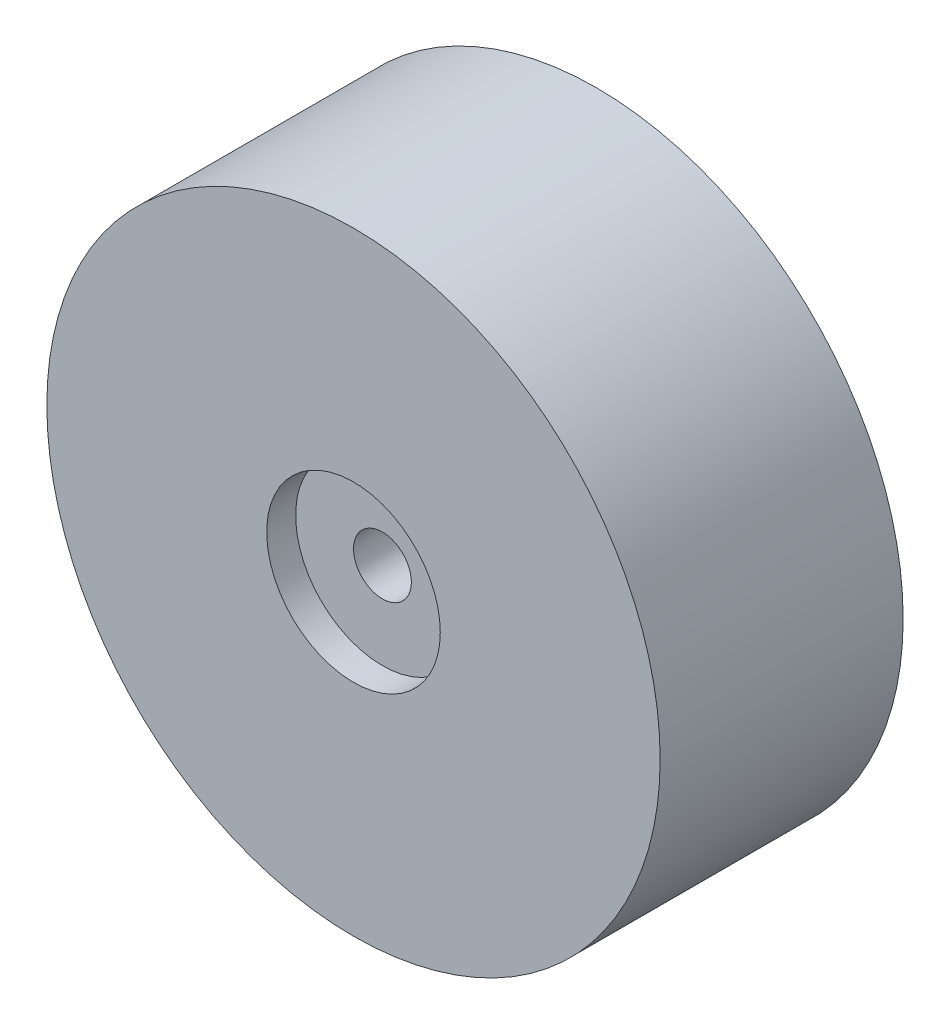
ISO-10303-21;
HEADER;
FILE_DESCRIPTION(('STEP AP214'),'2;1');
FILE_NAME('part.step','',(''),(''),'','','');
FILE_SCHEMA(('AUTOMOTIVE_DESIGN { 1 0 10303 214 1 1 1 1 }'));
ENDSEC;
DATA;
#1=APPLICATION_CONTEXT('core data for automotive mechanical design processes');
#2=APPLICATION_PROTOCOL_DEFINITION('international standard','automotive_design',2000,#1);
#3=PRODUCT_CONTEXT('',#1,'mechanical');
#4=PRODUCT('Part','Part','',(#3));
#5=PRODUCT_RELATED_PRODUCT_CATEGORY('part','',(#4));
#6=PRODUCT_DEFINITION_FORMATION('','',#4);
#7=PRODUCT_DEFINITION_CONTEXT('part definition',#1,'design');
#8=PRODUCT_DEFINITION('design','',#6,#7);
#9=PRODUCT_DEFINITION_SHAPE('','',#8);
#10=(LENGTH_UNIT() NAMED_UNIT(*) SI_UNIT(.MILLI.,.METRE.));
#11=(NAMED_UNIT(*) PLANE_ANGLE_UNIT() SI_UNIT($,.RADIAN.));
#12=(NAMED_UNIT(*) SI_UNIT($,.STERADIAN.) SOLID_ANGLE_UNIT());
#13=UNCERTAINTY_MEASURE_WITH_UNIT(LENGTH_MEASURE(1.E-05),#10,'distance_accuracy_value','');
#14=(GEOMETRIC_REPRESENTATION_CONTEXT(3) GLOBAL_UNCERTAINTY_ASSIGNED_CONTEXT((#13)) GLOBAL_UNIT_ASSIGNED_CONTEXT((#10,
#11,#12)) REPRESENTATION_CONTEXT('',''));
#15=CARTESIAN_POINT('',(0.,0.,0.));
#16=DIRECTION('',(0.,0.,1.));
#17=DIRECTION('',(1.,0.,0.));
#18=AXIS2_PLACEMENT_3D('',#15,#16,#17);
#19=CARTESIAN_POINT('',(0.,0.,-10.5));
#20=DIRECTION('',(0.,0.,1.));
#21=DIRECTION('',(1.,0.,0.));
#22=AXIS2_PLACEMENT_3D('',#19,#20,#21);
#23=CYLINDRICAL_SURFACE('',#22,7.5);
#24=CARTESIAN_POINT('',(0.,0.,-10.5));
#25=DIRECTION('',(0.,0.,1.));
#26=DIRECTION('',(1.,0.,0.));
#27=AXIS2_PLACEMENT_3D('',#24,#25,#26);
#28=CIRCLE('',#27,7.5);
#29=CARTESIAN_POINT('',(7.5,0.,-10.5));
#30=VERTEX_POINT('',#29);
#31=EDGE_CURVE('E41',#30,#30,#28,.T.);
#32=CARTESIAN_POINT('',(0.,0.,-8.));
#33=DIRECTION('',(0.,0.,1.));
#34=DIRECTION('',(1.,0.,0.));
#35=AXIS2_PLACEMENT_3D('',#32,#33,#34);
#36=CIRCLE('',#35,7.5);
#37=CARTESIAN_POINT('',(7.5,0.,-8.));
#38=VERTEX_POINT('',#37);
#39=EDGE_CURVE('E10',#38,#38,#36,.F.);
#40=CARTESIAN_POINT('',(7.5,0.,-10.5));
#41=CARTESIAN_POINT('',(7.5,0.,-10.4739583333333));
#42=CARTESIAN_POINT('',(7.5,0.,-10.4479166666667));
#43=CARTESIAN_POINT('',(7.5,0.,-10.3958333333333));
#44=CARTESIAN_POINT('',(7.5,0.,-10.3697916666667));
#45=CARTESIAN_POINT('',(7.5,0.,-10.3177083333333));
#46=CARTESIAN_POINT('',(7.5,0.,-10.2916666666667));
#47=CARTESIAN_POINT('',(7.5,0.,-10.2395833333333));
#48=CARTESIAN_POINT('',(7.5,0.,-10.2135416666667));
#49=CARTESIAN_POINT('',(7.5,0.,-10.1614583333333));
#50=CARTESIAN_POINT('',(7.5,0.,-10.1354166666667));
#51=CARTESIAN_POINT('',(7.5,0.,-10.0833333333333));
#52=CARTESIAN_POINT('',(7.5,0.,-10.0572916666667));
#53=CARTESIAN_POINT('',(7.5,0.,-10.0052083333333));
#54=CARTESIAN_POINT('',(7.5,0.,-9.97916666666667));
#55=CARTESIAN_POINT('',(7.5,0.,-9.92708333333333));
#56=CARTESIAN_POINT('',(7.5,0.,-9.90104166666667));
#57=CARTESIAN_POINT('',(7.5,0.,-9.84895833333333));
#58=CARTESIAN_POINT('',(7.5,0.,-9.82291666666667));
#59=CARTESIAN_POINT('',(7.5,0.,-9.77083333333333));
#60=CARTESIAN_POINT('',(7.5,0.,-9.74479166666667));
#61=CARTESIAN_POINT('',(7.5,0.,-9.69270833333333));
#62=CARTESIAN_POINT('',(7.5,0.,-9.66666666666667));
#63=CARTESIAN_POINT('',(7.5,0.,-9.61458333333333));
#64=CARTESIAN_POINT('',(7.5,0.,-9.58854166666667));
#65=CARTESIAN_POINT('',(7.5,0.,-9.53645833333333));
#66=CARTESIAN_POINT('',(7.5,0.,-9.51041666666667));
#67=CARTESIAN_POINT('',(7.5,0.,-9.45833333333333));
#68=CARTESIAN_POINT('',(7.5,0.,-9.43229166666667));
#69=CARTESIAN_POINT('',(7.5,0.,-9.38020833333333));
#70=CARTESIAN_POINT('',(7.5,0.,-9.35416666666667));
#71=CARTESIAN_POINT('',(7.5,0.,-9.30208333333333));
#72=CARTESIAN_POINT('',(7.5,0.,-9.27604166666667));
#73=CARTESIAN_POINT('',(7.5,0.,-9.22395833333333));
#74=CARTESIAN_POINT('',(7.5,0.,-9.19791666666667));
#75=CARTESIAN_POINT('',(7.5,0.,-9.14583333333333));
#76=CARTESIAN_POINT('',(7.5,0.,-9.11979166666667));
#77=CARTESIAN_POINT('',(7.5,0.,-9.06770833333333));
#78=CARTESIAN_POINT('',(7.5,0.,-9.04166666666667));
#79=CARTESIAN_POINT('',(7.5,0.,-8.98958333333333));
#80=CARTESIAN_POINT('',(7.5,0.,-8.96354166666667));
#81=CARTESIAN_POINT('',(7.5,0.,-8.91145833333333));
#82=CARTESIAN_POINT('',(7.5,0.,-8.88541666666667));
#83=CARTESIAN_POINT('',(7.5,0.,-8.83333333333333));
#84=CARTESIAN_POINT('',(7.5,0.,-8.80729166666667));
#85=CARTESIAN_POINT('',(7.5,0.,-8.75520833333333));
#86=CARTESIAN_POINT('',(7.5,0.,-8.72916666666667));
#87=CARTESIAN_POINT('',(7.5,0.,-8.67708333333333));
#88=CARTESIAN_POINT('',(7.5,0.,-8.65104166666667));
#89=CARTESIAN_POINT('',(7.5,0.,-8.59895833333333));
#90=CARTESIAN_POINT('',(7.5,0.,-8.57291666666667));
#91=CARTESIAN_POINT('',(7.5,0.,-8.52083333333333));
#92=CARTESIAN_POINT('',(7.5,0.,-8.49479166666667));
#93=CARTESIAN_POINT('',(7.5,0.,-8.44270833333334));
#94=CARTESIAN_POINT('',(7.5,0.,-8.41666666666667));
#95=CARTESIAN_POINT('',(7.5,0.,-8.36458333333334));
#96=CARTESIAN_POINT('',(7.5,0.,-8.33854166666667));
#97=CARTESIAN_POINT('',(7.5,0.,-8.28645833333334));
#98=CARTESIAN_POINT('',(7.5,0.,-8.26041666666667));
#99=CARTESIAN_POINT('',(7.5,0.,-8.20833333333334));
#100=CARTESIAN_POINT('',(7.5,0.,-8.18229166666667));
#101=CARTESIAN_POINT('',(7.5,0.,-8.13020833333333));
#102=CARTESIAN_POINT('',(7.5,0.,-8.10416666666667));
#103=CARTESIAN_POINT('',(7.5,0.,-8.05208333333333));
#104=CARTESIAN_POINT('',(7.5,0.,-8.02604166666667));
#105=CARTESIAN_POINT('',(7.5,0.,-8.));
#106=B_SPLINE_CURVE_WITH_KNOTS('',3,(#40,#41,#42,#43,#44,#45,#46,#47,#48,#49,#50,#51,#52,#53,
#54,#55,#56,#57,#58,#59,#60,#61,#62,#63,#64,#65,#66,#67,#68,#69,#70,#71,#72,#73,#74,#75,#76,#77,
#78,#79,#80,#81,#82,#83,#84,#85,#86,#87,#88,#89,#90,#91,#92,#93,#94,#95,#96,#97,#98,#99,#100,
#101,#102,#103,#104,#105),.UNSPECIFIED.,.F.,.F.,(4,2,2,2,2,2,2,2,2,2,2,2,2,2,2,2,2,2,2,2,2,2,2,
2,2,2,2,2,2,2,2,2,4),(0.,0.0781249999999983,0.156249999999998,0.234374999999998,
0.312499999999999,0.390624999999999,0.468749999999999,0.546874999999999,0.624999999999999,
0.703124999999999,0.781249999999999,0.859374999999999,0.937499999999999,1.015625,1.09375,
1.171875,1.25,1.328125,1.40625,1.484375,1.5625,1.640625,1.71875,1.796875,1.875,1.953125,2.03125,
2.109375,2.1875,2.265625,2.34375,2.421875,2.5),.UNSPECIFIED.);
#107=EDGE_CURVE('BSEAM30',#30,#38,#106,.T.);
#108=ORIENTED_EDGE('',*,*,#31,.F.);
#109=ORIENTED_EDGE('',*,*,#39,.F.);
#110=ORIENTED_EDGE('',*,*,#107,.T.);
#111=ORIENTED_EDGE('',*,*,#107,.F.);
#112=EDGE_LOOP('',(#108,#110,#109,#111));
#113=FACE_BOUND('',#112,.T.);
#114=ADVANCED_FACE('F30',(#113),#23,.F.);
#115=CARTESIAN_POINT('',(0.,0.,-10.5));
#116=DIRECTION('',(0.,0.,1.));
#117=DIRECTION('',(1.,0.,0.));
#118=AXIS2_PLACEMENT_3D('',#115,#116,#117);
#119=CYLINDRICAL_SURFACE('',#118,26.5);
#120=CARTESIAN_POINT('',(0.,0.,-10.5));
#121=DIRECTION('',(0.,0.,1.));
#122=DIRECTION('',(1.,0.,0.));
#123=AXIS2_PLACEMENT_3D('',#120,#121,#122);
#124=CIRCLE('',#123,26.5);
#125=CARTESIAN_POINT('',(26.5,0.,-10.5));
#126=VERTEX_POINT('',#125);
#127=EDGE_CURVE('E37',#126,#126,#124,.T.);
#128=CARTESIAN_POINT('',(0.,0.,10.5));
#129=DIRECTION('',(0.,0.,1.));
#130=DIRECTION('',(1.,0.,0.));
#131=AXIS2_PLACEMENT_3D('',#128,#129,#130);
#132=CIRCLE('',#131,26.5);
#133=CARTESIAN_POINT('',(26.5,0.,10.5));
#134=VERTEX_POINT('',#133);
#135=EDGE_CURVE('E45',#134,#134,#132,.T.);
#136=CARTESIAN_POINT('',(26.5,0.,-10.5));
#137=CARTESIAN_POINT('',(26.5,0.,-10.28125));
#138=CARTESIAN_POINT('',(26.5,0.,-10.0625));
#139=CARTESIAN_POINT('',(26.5,0.,-9.625));
#140=CARTESIAN_POINT('',(26.5,0.,-9.40625));
#141=CARTESIAN_POINT('',(26.5,0.,-8.96875));
#142=CARTESIAN_POINT('',(26.5,0.,-8.75));
#143=CARTESIAN_POINT('',(26.5,0.,-8.3125));
#144=CARTESIAN_POINT('',(26.5,0.,-8.09375));
#145=CARTESIAN_POINT('',(26.5,0.,-7.65625));
#146=CARTESIAN_POINT('',(26.5,0.,-7.4375));
#147=CARTESIAN_POINT('',(26.5,0.,-7.));
#148=CARTESIAN_POINT('',(26.5,0.,-6.78125));
#149=CARTESIAN_POINT('',(26.5,0.,-6.34375));
#150=CARTESIAN_POINT('',(26.5,0.,-6.125));
#151=CARTESIAN_POINT('',(26.5,0.,-5.6875));
#152=CARTESIAN_POINT('',(26.5,0.,-5.46875));
#153=CARTESIAN_POINT('',(26.5,0.,-5.03125));
#154=CARTESIAN_POINT('',(26.5,0.,-4.8125));
#155=CARTESIAN_POINT('',(26.5,0.,-4.375));
#156=CARTESIAN_POINT('',(26.5,0.,-4.15625));
#157=CARTESIAN_POINT('',(26.5,0.,-3.71875));
#158=CARTESIAN_POINT('',(26.5,0.,-3.5));
#159=CARTESIAN_POINT('',(26.5,0.,-3.0625));
#160=CARTESIAN_POINT('',(26.5,0.,-2.84375));
#161=CARTESIAN_POINT('',(26.5,0.,-2.40625));
#162=CARTESIAN_POINT('',(26.5,0.,-2.1875));
#163=CARTESIAN_POINT('',(26.5,0.,-1.75));
#164=CARTESIAN_POINT('',(26.5,0.,-1.53125));
#165=CARTESIAN_POINT('',(26.5,0.,-1.09375));
#166=CARTESIAN_POINT('',(26.5,0.,-0.875000000000003));
#167=CARTESIAN_POINT('',(26.5,0.,-0.437500000000002));
#168=CARTESIAN_POINT('',(26.5,0.,-0.218750000000002));
#169=CARTESIAN_POINT('',(26.5,0.,0.218749999999998));
#170=CARTESIAN_POINT('',(26.5,0.,0.437499999999999));
#171=CARTESIAN_POINT('',(26.5,0.,0.874999999999999));
#172=CARTESIAN_POINT('',(26.5,0.,1.09375));
#173=CARTESIAN_POINT('',(26.5,0.,1.53125));
#174=CARTESIAN_POINT('',(26.5,0.,1.75));
#175=CARTESIAN_POINT('',(26.5,0.,2.1875));
#176=CARTESIAN_POINT('',(26.5,0.,2.40625));
#177=CARTESIAN_POINT('',(26.5,0.,2.84375));
#178=CARTESIAN_POINT('',(26.5,0.,3.0625));
#179=CARTESIAN_POINT('',(26.5,0.,3.5));
#180=CARTESIAN_POINT('',(26.5,0.,3.71875));
#181=CARTESIAN_POINT('',(26.5,0.,4.15625));
#182=CARTESIAN_POINT('',(26.5,0.,4.375));
#183=CARTESIAN_POINT('',(26.5,0.,4.8125));
#184=CARTESIAN_POINT('',(26.5,0.,5.03125));
#185=CARTESIAN_POINT('',(26.5,0.,5.46875));
#186=CARTESIAN_POINT('',(26.5,0.,5.6875));
#187=CARTESIAN_POINT('',(26.5,0.,6.125));
#188=CARTESIAN_POINT('',(26.5,0.,6.34375));
#189=CARTESIAN_POINT('',(26.5,0.,6.78125));
#190=CARTESIAN_POINT('',(26.5,0.,7.));
#191=CARTESIAN_POINT('',(26.5,0.,7.4375));
#192=CARTESIAN_POINT('',(26.5,0.,7.65625));
#193=CARTESIAN_POINT('',(26.5,0.,8.09375));
#194=CARTESIAN_POINT('',(26.5,0.,8.3125));
#195=CARTESIAN_POINT('',(26.5,0.,8.75));
#196=CARTESIAN_POINT('',(26.5,0.,8.96875));
#197=CARTESIAN_POINT('',(26.5,0.,9.40625));
#198=CARTESIAN_POINT('',(26.5,0.,9.625));
#199=CARTESIAN_POINT('',(26.5,0.,10.0625));
#200=CARTESIAN_POINT('',(26.5,0.,10.28125));
#201=CARTESIAN_POINT('',(26.5,0.,10.5));
#202=B_SPLINE_CURVE_WITH_KNOTS('',3,(#136,#137,#138,#139,#140,#141,#142,#143,#144,#145,#146,
#147,#148,#149,#150,#151,#152,#153,#154,#155,#156,#157,#158,#159,#160,#161,#162,#163,#164,#165,
#166,#167,#168,#169,#170,#171,#172,#173,#174,#175,#176,#177,#178,#179,#180,#181,#182,#183,#184,
#185,#186,#187,#188,#189,#190,#191,#192,#193,#194,#195,#196,#197,#198,#199,#200,#201),
.UNSPECIFIED.,.F.,.F.,(4,2,2,2,2,2,2,2,2,2,2,2,2,2,2,2,2,2,2,2,2,2,2,2,2,2,2,2,2,2,2,2,4),(0.,
0.656250000000001,1.3125,1.96875,2.625,3.28125,3.9375,4.59375,5.25,5.90625,6.5625,7.21875,7.875,
8.53125,9.1875,9.84375,10.5,11.15625,11.8125,12.46875,13.125,13.78125,14.4375,15.09375,15.75,
16.40625,17.0625,17.71875,18.375,19.03125,19.6875,20.34375,21.),.UNSPECIFIED.);
#203=EDGE_CURVE('BSEAM32',#126,#134,#202,.T.);
#204=ORIENTED_EDGE('',*,*,#127,.T.);
#205=ORIENTED_EDGE('',*,*,#135,.F.);
#206=ORIENTED_EDGE('',*,*,#203,.T.);
#207=ORIENTED_EDGE('',*,*,#203,.F.);
#208=EDGE_LOOP('',(#204,#206,#205,#207));
#209=FACE_BOUND('',#208,.T.);
#210=ADVANCED_FACE('F32',(#209),#119,.T.);
#211=CARTESIAN_POINT('',(0.,0.,-10.5));
#212=DIRECTION('',(0.,0.,1.));
#213=DIRECTION('',(1.,0.,0.));
#214=AXIS2_PLACEMENT_3D('',#211,#212,#213);
#215=PLANE('',#214);
#216=ORIENTED_EDGE('',*,*,#31,.T.);
#217=EDGE_LOOP('',(#216));
#218=FACE_BOUND('',#217,.T.);
#219=ORIENTED_EDGE('',*,*,#127,.F.);
#220=EDGE_LOOP('',(#219));
#221=FACE_BOUND('',#220,.T.);
#222=ADVANCED_FACE('F82',(#218,#221),#215,.F.);
#223=CARTESIAN_POINT('',(0.,0.,8.));
#224=DIRECTION('',(0.,0.,1.));
#225=DIRECTION('',(1.,0.,0.));
#226=AXIS2_PLACEMENT_3D('',#223,#224,#225);
#227=CIRCLE('',#226,7.5);
#228=CARTESIAN_POINT('',(7.5,0.,8.));
#229=VERTEX_POINT('',#228);
#230=EDGE_CURVE('E56',#229,#229,#227,.T.);
#231=CARTESIAN_POINT('',(0.,0.,10.5));
#232=DIRECTION('',(0.,0.,1.));
#233=DIRECTION('',(1.,0.,0.));
#234=AXIS2_PLACEMENT_3D('',#231,#232,#233);
#235=CIRCLE('',#234,7.5);
#236=CARTESIAN_POINT('',(7.5,0.,10.5));
#237=VERTEX_POINT('',#236);
#238=EDGE_CURVE('E50',#237,#237,#235,.T.);
#239=CARTESIAN_POINT('',(7.5,0.,8.));
#240=CARTESIAN_POINT('',(7.5,0.,8.02604166666666));
#241=CARTESIAN_POINT('',(7.5,0.,8.05208333333333));
#242=CARTESIAN_POINT('',(7.5,0.,8.10416666666666));
#243=CARTESIAN_POINT('',(7.5,0.,8.13020833333333));
#244=CARTESIAN_POINT('',(7.5,0.,8.18229166666667));
#245=CARTESIAN_POINT('',(7.5,0.,8.20833333333333));
#246=CARTESIAN_POINT('',(7.5,0.,8.26041666666667));
#247=CARTESIAN_POINT('',(7.5,0.,8.28645833333333));
#248=CARTESIAN_POINT('',(7.5,0.,8.33854166666666));
#249=CARTESIAN_POINT('',(7.5,0.,8.36458333333333));
#250=CARTESIAN_POINT('',(7.5,0.,8.41666666666666));
#251=CARTESIAN_POINT('',(7.5,0.,8.44270833333333));
#252=CARTESIAN_POINT('',(7.5,0.,8.49479166666667));
#253=CARTESIAN_POINT('',(7.5,0.,8.52083333333333));
#254=CARTESIAN_POINT('',(7.5,0.,8.57291666666667));
#255=CARTESIAN_POINT('',(7.5,0.,8.59895833333333));
#256=CARTESIAN_POINT('',(7.5,0.,8.65104166666666));
#257=CARTESIAN_POINT('',(7.5,0.,8.67708333333333));
#258=CARTESIAN_POINT('',(7.5,0.,8.72916666666666));
#259=CARTESIAN_POINT('',(7.5,0.,8.75520833333333));
#260=CARTESIAN_POINT('',(7.5,0.,8.80729166666667));
#261=CARTESIAN_POINT('',(7.5,0.,8.83333333333333));
#262=CARTESIAN_POINT('',(7.5,0.,8.88541666666667));
#263=CARTESIAN_POINT('',(7.5,0.,8.91145833333333));
#264=CARTESIAN_POINT('',(7.5,0.,8.96354166666666));
#265=CARTESIAN_POINT('',(7.5,0.,8.98958333333333));
#266=CARTESIAN_POINT('',(7.5,0.,9.04166666666666));
#267=CARTESIAN_POINT('',(7.5,0.,9.06770833333333));
#268=CARTESIAN_POINT('',(7.5,0.,9.11979166666667));
#269=CARTESIAN_POINT('',(7.5,0.,9.14583333333333));
#270=CARTESIAN_POINT('',(7.5,0.,9.19791666666667));
#271=CARTESIAN_POINT('',(7.5,0.,9.22395833333333));
#272=CARTESIAN_POINT('',(7.5,0.,9.27604166666666));
#273=CARTESIAN_POINT('',(7.5,0.,9.30208333333333));
#274=CARTESIAN_POINT('',(7.5,0.,9.35416666666666));
#275=CARTESIAN_POINT('',(7.5,0.,9.38020833333333));
#276=CARTESIAN_POINT('',(7.5,0.,9.43229166666667));
#277=CARTESIAN_POINT('',(7.5,0.,9.45833333333333));
#278=CARTESIAN_POINT('',(7.5,0.,9.51041666666667));
#279=CARTESIAN_POINT('',(7.5,0.,9.53645833333333));
#280=CARTESIAN_POINT('',(7.5,0.,9.58854166666667));
#281=CARTESIAN_POINT('',(7.5,0.,9.61458333333333));
#282=CARTESIAN_POINT('',(7.5,0.,9.66666666666667));
#283=CARTESIAN_POINT('',(7.5,0.,9.69270833333333));
#284=CARTESIAN_POINT('',(7.5,0.,9.74479166666667));
#285=CARTESIAN_POINT('',(7.5,0.,9.77083333333333));
#286=CARTESIAN_POINT('',(7.5,0.,9.82291666666667));
#287=CARTESIAN_POINT('',(7.5,0.,9.84895833333333));
#288=CARTESIAN_POINT('',(7.5,0.,9.90104166666667));
#289=CARTESIAN_POINT('',(7.5,0.,9.92708333333333));
#290=CARTESIAN_POINT('',(7.5,0.,9.97916666666667));
#291=CARTESIAN_POINT('',(7.5,0.,10.0052083333333));
#292=CARTESIAN_POINT('',(7.5,0.,10.0572916666667));
#293=CARTESIAN_POINT('',(7.5,0.,10.0833333333333));
#294=CARTESIAN_POINT('',(7.5,0.,10.1354166666667));
#295=CARTESIAN_POINT('',(7.5,0.,10.1614583333333));
#296=CARTESIAN_POINT('',(7.5,0.,10.2135416666667));
#297=CARTESIAN_POINT('',(7.5,0.,10.2395833333333));
#298=CARTESIAN_POINT('',(7.5,0.,10.2916666666667));
#299=CARTESIAN_POINT('',(7.5,0.,10.3177083333333));
#300=CARTESIAN_POINT('',(7.5,0.,10.3697916666667));
#301=CARTESIAN_POINT('',(7.5,0.,10.3958333333333));
#302=CARTESIAN_POINT('',(7.5,0.,10.4479166666667));
#303=CARTESIAN_POINT('',(7.5,0.,10.4739583333333));
#304=CARTESIAN_POINT('',(7.5,0.,10.5));
#305=B_SPLINE_CURVE_WITH_KNOTS('',3,(#239,#240,#241,#242,#243,#244,#245,#246,#247,#248,#249,
#250,#251,#252,#253,#254,#255,#256,#257,#258,#259,#260,#261,#262,#263,#264,#265,#266,#267,#268,
#269,#270,#271,#272,#273,#274,#275,#276,#277,#278,#279,#280,#281,#282,#283,#284,#285,#286,#287,
#288,#289,#290,#291,#292,#293,#294,#295,#296,#297,#298,#299,#300,#301,#302,#303,#304),
.UNSPECIFIED.,.F.,.F.,(4,2,2,2,2,2,2,2,2,2,2,2,2,2,2,2,2,2,2,2,2,2,2,2,2,2,2,2,2,2,2,2,4),(0.,
0.0781249999999983,0.15625,0.234375000000002,0.3125,0.390624999999999,0.46875,0.546875000000002,
0.625000000000001,0.703124999999999,0.781250000000001,0.859375000000002,0.937500000000001,
1.015625,1.09375,1.171875,1.25,1.328125,1.40625,1.484375,1.5625,1.640625,1.71875,1.796875,1.875,
1.953125,2.03125,2.109375,2.1875,2.265625,2.34375,2.421875,2.5),.UNSPECIFIED.);
#306=EDGE_CURVE('BSEAM78',#229,#237,#305,.T.);
#307=ORIENTED_EDGE('',*,*,#230,.F.);
#308=ORIENTED_EDGE('',*,*,#238,.T.);
#309=ORIENTED_EDGE('',*,*,#306,.T.);
#310=ORIENTED_EDGE('',*,*,#306,.F.);
#311=EDGE_LOOP('',(#307,#309,#308,#310));
#312=FACE_BOUND('',#311,.T.);
#313=ADVANCED_FACE('F78',(#312),#23,.F.);
#314=CARTESIAN_POINT('',(0.,0.,10.5));
#315=DIRECTION('',(0.,0.,1.));
#316=DIRECTION('',(1.,0.,0.));
#317=AXIS2_PLACEMENT_3D('',#314,#315,#316);
#318=PLANE('',#317);
#319=ORIENTED_EDGE('',*,*,#135,.T.);
#320=EDGE_LOOP('',(#319));
#321=FACE_BOUND('',#320,.T.);
#322=ORIENTED_EDGE('',*,*,#238,.F.);
#323=EDGE_LOOP('',(#322));
#324=FACE_BOUND('',#323,.T.);
#325=ADVANCED_FACE('F87',(#321,#324),#318,.T.);
#326=CARTESIAN_POINT('',(0.,0.,-8.));
#327=DIRECTION('',(0.,0.,1.));
#328=DIRECTION('',(1.,0.,0.));
#329=AXIS2_PLACEMENT_3D('',#326,#327,#328);
#330=PLANE('',#329);
#331=CARTESIAN_POINT('',(0.,0.,-8.));
#332=DIRECTION('',(0.,0.,1.));
#333=DIRECTION('',(1.,0.,0.));
#334=AXIS2_PLACEMENT_3D('',#331,#332,#333);
#335=CIRCLE('',#334,2.5);
#336=CARTESIAN_POINT('',(2.5,0.,-8.));
#337=VERTEX_POINT('',#336);
#338=EDGE_CURVE('E53',#337,#337,#335,.T.);
#339=ORIENTED_EDGE('',*,*,#338,.T.);
#340=EDGE_LOOP('',(#339));
#341=FACE_BOUND('',#340,.T.);
#342=ORIENTED_EDGE('',*,*,#39,.T.);
#343=EDGE_LOOP('',(#342));
#344=FACE_BOUND('',#343,.T.);
#345=ADVANCED_FACE('F72',(#341,#344),#330,.F.);
#346=CARTESIAN_POINT('',(0.,0.,-8.));
#347=DIRECTION('',(0.,0.,1.));
#348=DIRECTION('',(1.,0.,0.));
#349=AXIS2_PLACEMENT_3D('',#346,#347,#348);
#350=CYLINDRICAL_SURFACE('',#349,2.5);
#351=ORIENTED_EDGE('',*,*,#338,.F.);
#352=EDGE_LOOP('',(#351));
#353=FACE_BOUND('',#352,.T.);
#354=CARTESIAN_POINT('',(0.,0.,8.));
#355=DIRECTION('',(0.,0.,1.));
#356=DIRECTION('',(1.,0.,0.));
#357=AXIS2_PLACEMENT_3D('',#354,#355,#356);
#358=CIRCLE('',#357,2.5);
#359=CARTESIAN_POINT('',(2.5,0.,8.));
#360=VERTEX_POINT('',#359);
#361=EDGE_CURVE('E59',#360,#360,#358,.T.);
#362=ORIENTED_EDGE('',*,*,#361,.T.);
#363=EDGE_LOOP('',(#362));
#364=FACE_BOUND('',#363,.T.);
#365=ADVANCED_FACE('F63',(#353,#364),#350,.F.);
#366=CARTESIAN_POINT('',(0.,0.,8.));
#367=DIRECTION('',(0.,0.,1.));
#368=DIRECTION('',(1.,0.,0.));
#369=AXIS2_PLACEMENT_3D('',#366,#367,#368);
#370=PLANE('',#369);
#371=ORIENTED_EDGE('',*,*,#230,.T.);
#372=EDGE_LOOP('',(#371));
#373=FACE_BOUND('',#372,.T.);
#374=ORIENTED_EDGE('',*,*,#361,.F.);
#375=EDGE_LOOP('',(#374));
#376=FACE_BOUND('',#375,.T.);
#377=ADVANCED_FACE('F65',(#373,#376),#370,.T.);
#378=CLOSED_SHELL('',(#114,#210,#222,#313,#325,#345,#365,#377));
#379=MANIFOLD_SOLID_BREP('B2',#378);
#380=ADVANCED_BREP_SHAPE_REPRESENTATION('',(#18,#379),#14);
#381=SHAPE_DEFINITION_REPRESENTATION(#9,#380);
ENDSEC;
END-ISO-10303-21;
